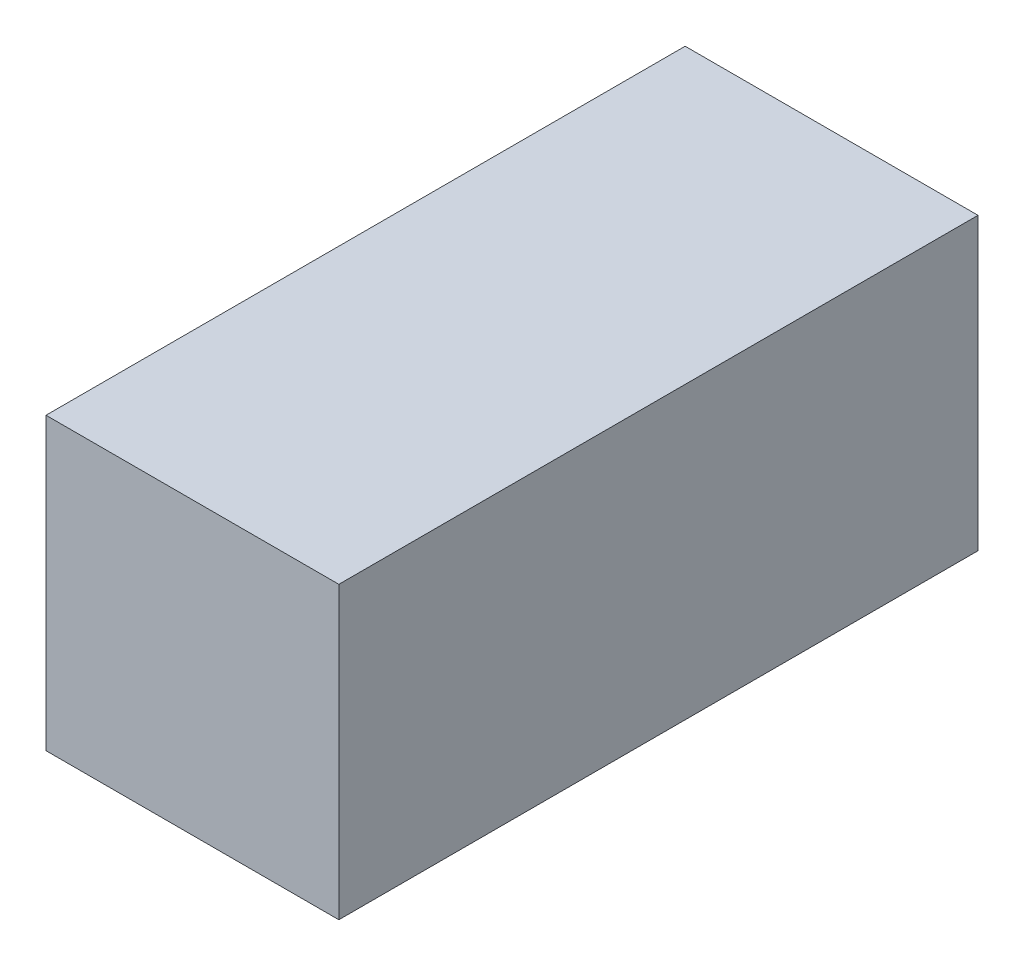
ISO-10303-21;
HEADER;
FILE_DESCRIPTION(('STEP AP214'),'2;1');
FILE_NAME('part.step','',(''),(''),'','','');
FILE_SCHEMA(('AUTOMOTIVE_DESIGN { 1 0 10303 214 1 1 1 1 }'));
ENDSEC;
DATA;
#1=APPLICATION_CONTEXT('core data for automotive mechanical design processes');
#2=APPLICATION_PROTOCOL_DEFINITION('international standard','automotive_design',2000,#1);
#3=PRODUCT_CONTEXT('',#1,'mechanical');
#4=PRODUCT('Part','Part','',(#3));
#5=PRODUCT_RELATED_PRODUCT_CATEGORY('part','',(#4));
#6=PRODUCT_DEFINITION_FORMATION('','',#4);
#7=PRODUCT_DEFINITION_CONTEXT('part definition',#1,'design');
#8=PRODUCT_DEFINITION('design','',#6,#7);
#9=PRODUCT_DEFINITION_SHAPE('','',#8);
#10=(LENGTH_UNIT() NAMED_UNIT(*) SI_UNIT(.MILLI.,.METRE.));
#11=(NAMED_UNIT(*) PLANE_ANGLE_UNIT() SI_UNIT($,.RADIAN.));
#12=(NAMED_UNIT(*) SI_UNIT($,.STERADIAN.) SOLID_ANGLE_UNIT());
#13=UNCERTAINTY_MEASURE_WITH_UNIT(LENGTH_MEASURE(1.E-05),#10,'distance_accuracy_value','');
#14=(GEOMETRIC_REPRESENTATION_CONTEXT(3) GLOBAL_UNCERTAINTY_ASSIGNED_CONTEXT((#13)) GLOBAL_UNIT_ASSIGNED_CONTEXT((#10,
#11,#12)) REPRESENTATION_CONTEXT('',''));
#15=CARTESIAN_POINT('',(0.,0.,0.));
#16=DIRECTION('',(0.,0.,1.));
#17=DIRECTION('',(1.,0.,0.));
#18=AXIS2_PLACEMENT_3D('',#15,#16,#17);
#19=CARTESIAN_POINT('',(462.182459860901,107.443926475068,-237.595929031739));
#20=DIRECTION('',(0.,0.,1.));
#21=DIRECTION('',(0.,-1.,0.));
#22=AXIS2_PLACEMENT_3D('',#19,#20,#21);
#23=PLANE('',#22);
#24=DIRECTION('',(1.,0.,0.));
#25=VECTOR('',#24,1.);
#26=CARTESIAN_POINT('',(462.182459860901,119.943926475068,-237.595929031739));
#27=LINE('',#26,#25);
#28=CARTESIAN_POINT('',(462.182459860901,119.943926475068,-237.595929031739));
#29=VERTEX_POINT('',#28);
#30=CARTESIAN_POINT('',(474.782459860901,119.943926475068,-237.595929031739));
#31=VERTEX_POINT('',#30);
#32=EDGE_CURVE('E95',#29,#31,#27,.T.);
#33=ORIENTED_EDGE('',*,*,#32,.T.);
#34=DIRECTION('',(0.,1.,0.));
#35=VECTOR('',#34,1.);
#36=CARTESIAN_POINT('',(474.782459860901,107.443926475068,-237.595929031739));
#37=LINE('',#36,#35);
#38=CARTESIAN_POINT('',(474.782459860901,107.443926475068,-237.595929031739));
#39=VERTEX_POINT('',#38);
#40=EDGE_CURVE('E11',#39,#31,#37,.T.);
#41=ORIENTED_EDGE('',*,*,#40,.F.);
#42=DIRECTION('',(1.,0.,0.));
#43=VECTOR('',#42,1.);
#44=CARTESIAN_POINT('',(462.182459860901,107.443926475068,-237.595929031739));
#45=LINE('',#44,#43);
#46=CARTESIAN_POINT('',(462.182459860901,107.443926475068,-237.595929031739));
#47=VERTEX_POINT('',#46);
#48=EDGE_CURVE('E72',#47,#39,#45,.T.);
#49=ORIENTED_EDGE('',*,*,#48,.F.);
#50=DIRECTION('',(0.,1.,0.));
#51=VECTOR('',#50,1.);
#52=CARTESIAN_POINT('',(462.182459860901,107.443926475068,-237.595929031739));
#53=LINE('',#52,#51);
#54=EDGE_CURVE('E91',#47,#29,#53,.T.);
#55=ORIENTED_EDGE('',*,*,#54,.T.);
#56=EDGE_LOOP('',(#33,#41,#49,#55));
#57=FACE_BOUND('',#56,.T.);
#58=ADVANCED_FACE('F33',(#57),#23,.F.);
#59=CARTESIAN_POINT('',(474.782459860901,107.443926475068,-210.095929031739));
#60=DIRECTION('',(1.,0.,0.));
#61=DIRECTION('',(0.,1.,0.));
#62=AXIS2_PLACEMENT_3D('',#59,#60,#61);
#63=PLANE('',#62);
#64=DIRECTION('',(0.,0.,-1.));
#65=VECTOR('',#64,1.);
#66=CARTESIAN_POINT('',(474.782459860901,119.943926475068,-210.095929031739));
#67=LINE('',#66,#65);
#68=CARTESIAN_POINT('',(474.782459860901,119.943926475068,-210.095929031739));
#69=VERTEX_POINT('',#68);
#70=EDGE_CURVE('E81',#69,#31,#67,.T.);
#71=ORIENTED_EDGE('',*,*,#70,.F.);
#72=DIRECTION('',(0.,1.,0.));
#73=VECTOR('',#72,1.);
#74=CARTESIAN_POINT('',(474.782459860901,107.443926475068,-210.095929031739));
#75=LINE('',#74,#73);
#76=CARTESIAN_POINT('',(474.782459860901,107.443926475068,-210.095929031739));
#77=VERTEX_POINT('',#76);
#78=EDGE_CURVE('E41',#77,#69,#75,.T.);
#79=ORIENTED_EDGE('',*,*,#78,.F.);
#80=DIRECTION('',(0.,0.,-1.));
#81=VECTOR('',#80,1.);
#82=CARTESIAN_POINT('',(474.782459860901,107.443926475068,-210.095929031739));
#83=LINE('',#82,#81);
#84=EDGE_CURVE('E79',#77,#39,#83,.T.);
#85=ORIENTED_EDGE('',*,*,#84,.T.);
#86=ORIENTED_EDGE('',*,*,#40,.T.);
#87=EDGE_LOOP('',(#71,#79,#85,#86));
#88=FACE_BOUND('',#87,.T.);
#89=ADVANCED_FACE('F78',(#88),#63,.T.);
#90=CARTESIAN_POINT('',(462.182459860901,107.443926475068,-210.095929031739));
#91=DIRECTION('',(0.,0.,1.));
#92=DIRECTION('',(0.,-1.,0.));
#93=AXIS2_PLACEMENT_3D('',#90,#91,#92);
#94=PLANE('',#93);
#95=DIRECTION('',(1.,0.,0.));
#96=VECTOR('',#95,1.);
#97=CARTESIAN_POINT('',(462.182459860901,119.943926475068,-210.095929031739));
#98=LINE('',#97,#96);
#99=CARTESIAN_POINT('',(462.182459860901,119.943926475068,-210.095929031739));
#100=VERTEX_POINT('',#99);
#101=EDGE_CURVE('E99',#100,#69,#98,.T.);
#102=ORIENTED_EDGE('',*,*,#101,.F.);
#103=DIRECTION('',(0.,1.,0.));
#104=VECTOR('',#103,1.);
#105=CARTESIAN_POINT('',(462.182459860901,107.443926475068,-210.095929031739));
#106=LINE('',#105,#104);
#107=CARTESIAN_POINT('',(462.182459860901,107.443926475068,-210.095929031739));
#108=VERTEX_POINT('',#107);
#109=EDGE_CURVE('E64',#108,#100,#106,.T.);
#110=ORIENTED_EDGE('',*,*,#109,.F.);
#111=DIRECTION('',(1.,0.,0.));
#112=VECTOR('',#111,1.);
#113=CARTESIAN_POINT('',(462.182459860901,107.443926475068,-210.095929031739));
#114=LINE('',#113,#112);
#115=EDGE_CURVE('E87',#108,#77,#114,.T.);
#116=ORIENTED_EDGE('',*,*,#115,.T.);
#117=ORIENTED_EDGE('',*,*,#78,.T.);
#118=EDGE_LOOP('',(#102,#110,#116,#117));
#119=FACE_BOUND('',#118,.T.);
#120=ADVANCED_FACE('F89',(#119),#94,.T.);
#121=CARTESIAN_POINT('',(462.182459860901,107.443926475068,-210.095929031739));
#122=DIRECTION('',(1.,0.,0.));
#123=DIRECTION('',(0.,1.,0.));
#124=AXIS2_PLACEMENT_3D('',#121,#122,#123);
#125=PLANE('',#124);
#126=DIRECTION('',(0.,0.,-1.));
#127=VECTOR('',#126,1.);
#128=CARTESIAN_POINT('',(462.182459860901,119.943926475068,-210.095929031739));
#129=LINE('',#128,#127);
#130=EDGE_CURVE('E67',#100,#29,#129,.T.);
#131=ORIENTED_EDGE('',*,*,#130,.T.);
#132=ORIENTED_EDGE('',*,*,#54,.F.);
#133=DIRECTION('',(0.,0.,-1.));
#134=VECTOR('',#133,1.);
#135=CARTESIAN_POINT('',(462.182459860901,107.443926475068,-210.095929031739));
#136=LINE('',#135,#134);
#137=EDGE_CURVE('E49',#108,#47,#136,.T.);
#138=ORIENTED_EDGE('',*,*,#137,.F.);
#139=ORIENTED_EDGE('',*,*,#109,.T.);
#140=EDGE_LOOP('',(#131,#132,#138,#139));
#141=FACE_BOUND('',#140,.T.);
#142=ADVANCED_FACE('F112',(#141),#125,.F.);
#143=CARTESIAN_POINT('',(0.,107.443926475068,0.));
#144=DIRECTION('',(0.,1.,0.));
#145=DIRECTION('',(0.,0.,1.));
#146=AXIS2_PLACEMENT_3D('',#143,#144,#145);
#147=PLANE('',#146);
#148=ORIENTED_EDGE('',*,*,#48,.T.);
#149=ORIENTED_EDGE('',*,*,#84,.F.);
#150=ORIENTED_EDGE('',*,*,#115,.F.);
#151=ORIENTED_EDGE('',*,*,#137,.T.);
#152=EDGE_LOOP('',(#148,#149,#150,#151));
#153=FACE_BOUND('',#152,.T.);
#154=ADVANCED_FACE('F86',(#153),#147,.F.);
#155=CARTESIAN_POINT('',(0.,119.943926475068,0.));
#156=DIRECTION('',(0.,1.,0.));
#157=DIRECTION('',(0.,0.,1.));
#158=AXIS2_PLACEMENT_3D('',#155,#156,#157);
#159=PLANE('',#158);
#160=ORIENTED_EDGE('',*,*,#32,.F.);
#161=ORIENTED_EDGE('',*,*,#130,.F.);
#162=ORIENTED_EDGE('',*,*,#101,.T.);
#163=ORIENTED_EDGE('',*,*,#70,.T.);
#164=EDGE_LOOP('',(#160,#161,#162,#163));
#165=FACE_BOUND('',#164,.T.);
#166=ADVANCED_FACE('F106',(#165),#159,.T.);
#167=CLOSED_SHELL('',(#58,#89,#120,#142,#154,#166));
#168=MANIFOLD_SOLID_BREP('B2',#167);
#169=ADVANCED_BREP_SHAPE_REPRESENTATION('',(#18,#168),#14);
#170=SHAPE_DEFINITION_REPRESENTATION(#9,#169);
ENDSEC;
END-ISO-10303-21;
